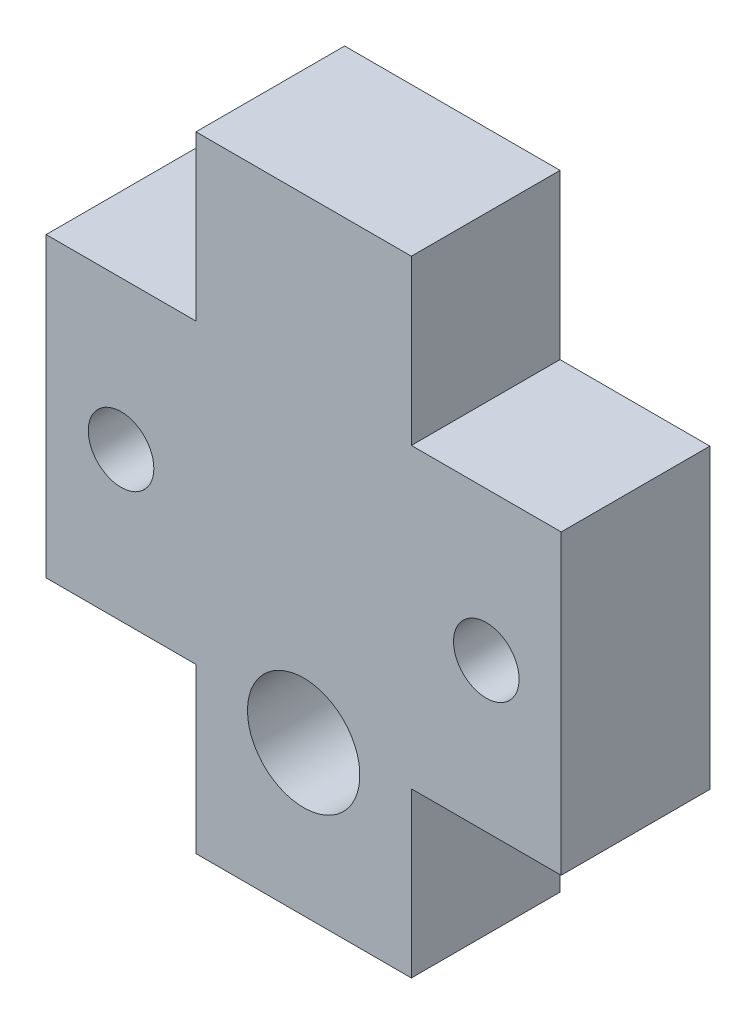
ISO-10303-21;
HEADER;
FILE_DESCRIPTION(('STEP AP214'),'2;1');
FILE_NAME('part.step','',(''),(''),'','','');
FILE_SCHEMA(('AUTOMOTIVE_DESIGN { 1 0 10303 214 1 1 1 1 }'));
ENDSEC;
DATA;
#1=APPLICATION_CONTEXT('core data for automotive mechanical design processes');
#2=APPLICATION_PROTOCOL_DEFINITION('international standard','automotive_design',2000,#1);
#3=PRODUCT_CONTEXT('',#1,'mechanical');
#4=PRODUCT('Part','Part','',(#3));
#5=PRODUCT_RELATED_PRODUCT_CATEGORY('part','',(#4));
#6=PRODUCT_DEFINITION_FORMATION('','',#4);
#7=PRODUCT_DEFINITION_CONTEXT('part definition',#1,'design');
#8=PRODUCT_DEFINITION('design','',#6,#7);
#9=PRODUCT_DEFINITION_SHAPE('','',#8);
#10=(LENGTH_UNIT() NAMED_UNIT(*) SI_UNIT(.MILLI.,.METRE.));
#11=(NAMED_UNIT(*) PLANE_ANGLE_UNIT() SI_UNIT($,.RADIAN.));
#12=(NAMED_UNIT(*) SI_UNIT($,.STERADIAN.) SOLID_ANGLE_UNIT());
#13=UNCERTAINTY_MEASURE_WITH_UNIT(LENGTH_MEASURE(1.E-05),#10,'distance_accuracy_value','');
#14=(GEOMETRIC_REPRESENTATION_CONTEXT(3) GLOBAL_UNCERTAINTY_ASSIGNED_CONTEXT((#13)) GLOBAL_UNIT_ASSIGNED_CONTEXT((#10,
#11,#12)) REPRESENTATION_CONTEXT('',''));
#15=CARTESIAN_POINT('',(0.,0.,0.));
#16=DIRECTION('',(0.,0.,1.));
#17=DIRECTION('',(1.,0.,0.));
#18=AXIS2_PLACEMENT_3D('',#15,#16,#17);
#19=CARTESIAN_POINT('',(11.,0.,6.35));
#20=DIRECTION('',(1.,0.,0.));
#21=DIRECTION('',(0.,0.,-1.));
#22=AXIS2_PLACEMENT_3D('',#19,#20,#21);
#23=PLANE('',#22);
#24=DIRECTION('',(0.,-1.,0.));
#25=VECTOR('',#24,1.);
#26=CARTESIAN_POINT('',(11.,0.,0.));
#27=LINE('',#26,#25);
#28=CARTESIAN_POINT('',(11.,6.35,0.));
#29=VERTEX_POINT('',#28);
#30=CARTESIAN_POINT('',(11.,-6.35,0.));
#31=VERTEX_POINT('',#30);
#32=EDGE_CURVE('E168',#29,#31,#27,.T.);
#33=ORIENTED_EDGE('',*,*,#32,.F.);
#34=DIRECTION('',(0.,0.,-1.));
#35=VECTOR('',#34,1.);
#36=CARTESIAN_POINT('',(11.,6.35,6.35));
#37=LINE('',#36,#35);
#38=CARTESIAN_POINT('',(11.,6.35,6.35));
#39=VERTEX_POINT('',#38);
#40=EDGE_CURVE('E11',#39,#29,#37,.T.);
#41=ORIENTED_EDGE('',*,*,#40,.F.);
#42=DIRECTION('',(0.,-1.,0.));
#43=VECTOR('',#42,1.);
#44=CARTESIAN_POINT('',(11.,0.,6.35));
#45=LINE('',#44,#43);
#46=CARTESIAN_POINT('',(11.,-6.35,6.35));
#47=VERTEX_POINT('',#46);
#48=EDGE_CURVE('E291',#39,#47,#45,.T.);
#49=ORIENTED_EDGE('',*,*,#48,.T.);
#50=DIRECTION('',(0.,0.,-1.));
#51=VECTOR('',#50,1.);
#52=CARTESIAN_POINT('',(11.,-6.35,6.35));
#53=LINE('',#52,#51);
#54=EDGE_CURVE('E100',#47,#31,#53,.T.);
#55=ORIENTED_EDGE('',*,*,#54,.T.);
#56=EDGE_LOOP('',(#33,#41,#49,#55));
#57=FACE_BOUND('',#56,.T.);
#58=ADVANCED_FACE('F36',(#57),#23,.T.);
#59=CARTESIAN_POINT('',(0.,6.35,6.35));
#60=DIRECTION('',(0.,1.,0.));
#61=DIRECTION('',(0.,0.,1.));
#62=AXIS2_PLACEMENT_3D('',#59,#60,#61);
#63=PLANE('',#62);
#64=DIRECTION('',(1.,0.,0.));
#65=VECTOR('',#64,1.);
#66=CARTESIAN_POINT('',(0.,6.35,0.));
#67=LINE('',#66,#65);
#68=CARTESIAN_POINT('',(4.6,6.35,0.));
#69=VERTEX_POINT('',#68);
#70=EDGE_CURVE('E171',#69,#29,#67,.T.);
#71=ORIENTED_EDGE('',*,*,#70,.F.);
#72=DIRECTION('',(0.,0.,-1.));
#73=VECTOR('',#72,1.);
#74=CARTESIAN_POINT('',(4.6,6.35,6.35));
#75=LINE('',#74,#73);
#76=CARTESIAN_POINT('',(4.6,6.35,6.35));
#77=VERTEX_POINT('',#76);
#78=EDGE_CURVE('E45',#77,#69,#75,.T.);
#79=ORIENTED_EDGE('',*,*,#78,.F.);
#80=DIRECTION('',(1.,0.,0.));
#81=VECTOR('',#80,1.);
#82=CARTESIAN_POINT('',(0.,6.35,6.35));
#83=LINE('',#82,#81);
#84=EDGE_CURVE('E228',#77,#39,#83,.T.);
#85=ORIENTED_EDGE('',*,*,#84,.T.);
#86=ORIENTED_EDGE('',*,*,#40,.T.);
#87=EDGE_LOOP('',(#71,#79,#85,#86));
#88=FACE_BOUND('',#87,.T.);
#89=ADVANCED_FACE('F227',(#88),#63,.T.);
#90=CARTESIAN_POINT('',(4.6,0.,6.35));
#91=DIRECTION('',(-1.,0.,0.));
#92=DIRECTION('',(0.,0.,1.));
#93=AXIS2_PLACEMENT_3D('',#90,#91,#92);
#94=PLANE('',#93);
#95=DIRECTION('',(0.,1.,0.));
#96=VECTOR('',#95,1.);
#97=CARTESIAN_POINT('',(4.6,0.,0.));
#98=LINE('',#97,#96);
#99=CARTESIAN_POINT('',(4.6,13.35,0.));
#100=VERTEX_POINT('',#99);
#101=EDGE_CURVE('E174',#69,#100,#98,.T.);
#102=ORIENTED_EDGE('',*,*,#101,.T.);
#103=DIRECTION('',(0.,0.,-1.));
#104=VECTOR('',#103,1.);
#105=CARTESIAN_POINT('',(4.6,13.35,6.35));
#106=LINE('',#105,#104);
#107=CARTESIAN_POINT('',(4.6,13.35,6.35));
#108=VERTEX_POINT('',#107);
#109=EDGE_CURVE('E213',#108,#100,#106,.T.);
#110=ORIENTED_EDGE('',*,*,#109,.F.);
#111=DIRECTION('',(0.,1.,0.));
#112=VECTOR('',#111,1.);
#113=CARTESIAN_POINT('',(4.6,0.,6.35));
#114=LINE('',#113,#112);
#115=EDGE_CURVE('E147',#77,#108,#114,.T.);
#116=ORIENTED_EDGE('',*,*,#115,.F.);
#117=ORIENTED_EDGE('',*,*,#78,.T.);
#118=EDGE_LOOP('',(#102,#110,#116,#117));
#119=FACE_BOUND('',#118,.T.);
#120=ADVANCED_FACE('F218',(#119),#94,.F.);
#121=CARTESIAN_POINT('',(0.,13.35,6.35));
#122=DIRECTION('',(0.,-1.,0.));
#123=DIRECTION('',(0.,0.,-1.));
#124=AXIS2_PLACEMENT_3D('',#121,#122,#123);
#125=PLANE('',#124);
#126=DIRECTION('',(-1.,0.,0.));
#127=VECTOR('',#126,1.);
#128=CARTESIAN_POINT('',(0.,13.35,0.));
#129=LINE('',#128,#127);
#130=CARTESIAN_POINT('',(-4.6,13.35,0.));
#131=VERTEX_POINT('',#130);
#132=EDGE_CURVE('E177',#100,#131,#129,.T.);
#133=ORIENTED_EDGE('',*,*,#132,.T.);
#134=DIRECTION('',(0.,0.,-1.));
#135=VECTOR('',#134,1.);
#136=CARTESIAN_POINT('',(-4.6,13.35,6.35));
#137=LINE('',#136,#135);
#138=CARTESIAN_POINT('',(-4.6,13.35,6.35));
#139=VERTEX_POINT('',#138);
#140=EDGE_CURVE('E211',#139,#131,#137,.T.);
#141=ORIENTED_EDGE('',*,*,#140,.F.);
#142=DIRECTION('',(-1.,0.,0.));
#143=VECTOR('',#142,1.);
#144=CARTESIAN_POINT('',(0.,13.35,6.35));
#145=LINE('',#144,#143);
#146=EDGE_CURVE('E294',#108,#139,#145,.T.);
#147=ORIENTED_EDGE('',*,*,#146,.F.);
#148=ORIENTED_EDGE('',*,*,#109,.T.);
#149=EDGE_LOOP('',(#133,#141,#147,#148));
#150=FACE_BOUND('',#149,.T.);
#151=ADVANCED_FACE('F235',(#150),#125,.F.);
#152=CARTESIAN_POINT('',(-4.6,0.,6.35));
#153=DIRECTION('',(-1.,0.,0.));
#154=DIRECTION('',(0.,0.,1.));
#155=AXIS2_PLACEMENT_3D('',#152,#153,#154);
#156=PLANE('',#155);
#157=DIRECTION('',(0.,1.,0.));
#158=VECTOR('',#157,1.);
#159=CARTESIAN_POINT('',(-4.6,0.,0.));
#160=LINE('',#159,#158);
#161=CARTESIAN_POINT('',(-4.6,6.35,0.));
#162=VERTEX_POINT('',#161);
#163=EDGE_CURVE('E181',#162,#131,#160,.T.);
#164=ORIENTED_EDGE('',*,*,#163,.F.);
#165=DIRECTION('',(0.,0.,-1.));
#166=VECTOR('',#165,1.);
#167=CARTESIAN_POINT('',(-4.6,6.35,6.35));
#168=LINE('',#167,#166);
#169=CARTESIAN_POINT('',(-4.6,6.35,6.35));
#170=VERTEX_POINT('',#169);
#171=EDGE_CURVE('E209',#170,#162,#168,.T.);
#172=ORIENTED_EDGE('',*,*,#171,.F.);
#173=DIRECTION('',(0.,1.,0.));
#174=VECTOR('',#173,1.);
#175=CARTESIAN_POINT('',(-4.6,0.,6.35));
#176=LINE('',#175,#174);
#177=EDGE_CURVE('E157',#170,#139,#176,.T.);
#178=ORIENTED_EDGE('',*,*,#177,.T.);
#179=ORIENTED_EDGE('',*,*,#140,.T.);
#180=EDGE_LOOP('',(#164,#172,#178,#179));
#181=FACE_BOUND('',#180,.T.);
#182=ADVANCED_FACE('F238',(#181),#156,.T.);
#183=CARTESIAN_POINT('',(0.,6.35,6.35));
#184=DIRECTION('',(0.,1.,0.));
#185=DIRECTION('',(0.,0.,1.));
#186=AXIS2_PLACEMENT_3D('',#183,#184,#185);
#187=PLANE('',#186);
#188=DIRECTION('',(1.,0.,0.));
#189=VECTOR('',#188,1.);
#190=CARTESIAN_POINT('',(0.,6.35,0.));
#191=LINE('',#190,#189);
#192=CARTESIAN_POINT('',(-11.,6.35,0.));
#193=VERTEX_POINT('',#192);
#194=EDGE_CURVE('E184',#193,#162,#191,.T.);
#195=ORIENTED_EDGE('',*,*,#194,.F.);
#196=DIRECTION('',(0.,0.,-1.));
#197=VECTOR('',#196,1.);
#198=CARTESIAN_POINT('',(-11.,6.35,6.35));
#199=LINE('',#198,#197);
#200=CARTESIAN_POINT('',(-11.,6.35,6.35));
#201=VERTEX_POINT('',#200);
#202=EDGE_CURVE('E207',#201,#193,#199,.T.);
#203=ORIENTED_EDGE('',*,*,#202,.F.);
#204=DIRECTION('',(1.,0.,0.));
#205=VECTOR('',#204,1.);
#206=CARTESIAN_POINT('',(0.,6.35,6.35));
#207=LINE('',#206,#205);
#208=EDGE_CURVE('E297',#201,#170,#207,.T.);
#209=ORIENTED_EDGE('',*,*,#208,.T.);
#210=ORIENTED_EDGE('',*,*,#171,.T.);
#211=EDGE_LOOP('',(#195,#203,#209,#210));
#212=FACE_BOUND('',#211,.T.);
#213=ADVANCED_FACE('F240',(#212),#187,.T.);
#214=CARTESIAN_POINT('',(-11.,0.,6.35));
#215=DIRECTION('',(1.,0.,0.));
#216=DIRECTION('',(0.,0.,-1.));
#217=AXIS2_PLACEMENT_3D('',#214,#215,#216);
#218=PLANE('',#217);
#219=DIRECTION('',(0.,-1.,0.));
#220=VECTOR('',#219,1.);
#221=CARTESIAN_POINT('',(-11.,0.,0.));
#222=LINE('',#221,#220);
#223=CARTESIAN_POINT('',(-11.,-6.35,0.));
#224=VERTEX_POINT('',#223);
#225=EDGE_CURVE('E188',#193,#224,#222,.T.);
#226=ORIENTED_EDGE('',*,*,#225,.T.);
#227=DIRECTION('',(0.,0.,-1.));
#228=VECTOR('',#227,1.);
#229=CARTESIAN_POINT('',(-11.,-6.35,6.35));
#230=LINE('',#229,#228);
#231=CARTESIAN_POINT('',(-11.,-6.35,6.35));
#232=VERTEX_POINT('',#231);
#233=EDGE_CURVE('E205',#232,#224,#230,.T.);
#234=ORIENTED_EDGE('',*,*,#233,.F.);
#235=DIRECTION('',(0.,-1.,0.));
#236=VECTOR('',#235,1.);
#237=CARTESIAN_POINT('',(-11.,0.,6.35));
#238=LINE('',#237,#236);
#239=EDGE_CURVE('E299',#201,#232,#238,.T.);
#240=ORIENTED_EDGE('',*,*,#239,.F.);
#241=ORIENTED_EDGE('',*,*,#202,.T.);
#242=EDGE_LOOP('',(#226,#234,#240,#241));
#243=FACE_BOUND('',#242,.T.);
#244=ADVANCED_FACE('F243',(#243),#218,.F.);
#245=CARTESIAN_POINT('',(0.,-6.35,6.35));
#246=DIRECTION('',(0.,-1.,0.));
#247=DIRECTION('',(0.,0.,-1.));
#248=AXIS2_PLACEMENT_3D('',#245,#246,#247);
#249=PLANE('',#248);
#250=DIRECTION('',(-1.,0.,0.));
#251=VECTOR('',#250,1.);
#252=CARTESIAN_POINT('',(0.,-6.35,0.));
#253=LINE('',#252,#251);
#254=CARTESIAN_POINT('',(-4.6,-6.35,0.));
#255=VERTEX_POINT('',#254);
#256=EDGE_CURVE('E191',#255,#224,#253,.T.);
#257=ORIENTED_EDGE('',*,*,#256,.F.);
#258=DIRECTION('',(0.,0.,-1.));
#259=VECTOR('',#258,1.);
#260=CARTESIAN_POINT('',(-4.6,-6.35,6.35));
#261=LINE('',#260,#259);
#262=CARTESIAN_POINT('',(-4.6,-6.35,6.35));
#263=VERTEX_POINT('',#262);
#264=EDGE_CURVE('E203',#263,#255,#261,.T.);
#265=ORIENTED_EDGE('',*,*,#264,.F.);
#266=DIRECTION('',(-1.,0.,0.));
#267=VECTOR('',#266,1.);
#268=CARTESIAN_POINT('',(0.,-6.35,6.35));
#269=LINE('',#268,#267);
#270=EDGE_CURVE('E155',#263,#232,#269,.T.);
#271=ORIENTED_EDGE('',*,*,#270,.T.);
#272=ORIENTED_EDGE('',*,*,#233,.T.);
#273=EDGE_LOOP('',(#257,#265,#271,#272));
#274=FACE_BOUND('',#273,.T.);
#275=ADVANCED_FACE('F247',(#274),#249,.T.);
#276=CARTESIAN_POINT('',(-4.6,-13.35,0.));
#277=VERTEX_POINT('',#276);
#278=EDGE_CURVE('E185',#277,#255,#160,.T.);
#279=ORIENTED_EDGE('',*,*,#278,.F.);
#280=DIRECTION('',(0.,0.,-1.));
#281=VECTOR('',#280,1.);
#282=CARTESIAN_POINT('',(-4.6,-13.35,6.35));
#283=LINE('',#282,#281);
#284=CARTESIAN_POINT('',(-4.6,-13.35,6.35));
#285=VERTEX_POINT('',#284);
#286=EDGE_CURVE('E140',#285,#277,#283,.T.);
#287=ORIENTED_EDGE('',*,*,#286,.F.);
#288=EDGE_CURVE('E153',#285,#263,#176,.T.);
#289=ORIENTED_EDGE('',*,*,#288,.T.);
#290=ORIENTED_EDGE('',*,*,#264,.T.);
#291=EDGE_LOOP('',(#279,#287,#289,#290));
#292=FACE_BOUND('',#291,.T.);
#293=ADVANCED_FACE('F251',(#292),#156,.T.);
#294=CARTESIAN_POINT('',(0.,-13.35,6.35));
#295=DIRECTION('',(0.,-1.,0.));
#296=DIRECTION('',(0.,0.,-1.));
#297=AXIS2_PLACEMENT_3D('',#294,#295,#296);
#298=PLANE('',#297);
#299=DIRECTION('',(-1.,0.,0.));
#300=VECTOR('',#299,1.);
#301=CARTESIAN_POINT('',(0.,-13.35,0.));
#302=LINE('',#301,#300);
#303=CARTESIAN_POINT('',(4.6,-13.35,0.));
#304=VERTEX_POINT('',#303);
#305=EDGE_CURVE('E137',#304,#277,#302,.T.);
#306=ORIENTED_EDGE('',*,*,#305,.F.);
#307=DIRECTION('',(0.,0.,-1.));
#308=VECTOR('',#307,1.);
#309=CARTESIAN_POINT('',(4.6,-13.35,6.35));
#310=LINE('',#309,#308);
#311=CARTESIAN_POINT('',(4.6,-13.35,6.35));
#312=VERTEX_POINT('',#311);
#313=EDGE_CURVE('E131',#312,#304,#310,.T.);
#314=ORIENTED_EDGE('',*,*,#313,.F.);
#315=DIRECTION('',(-1.,0.,0.));
#316=VECTOR('',#315,1.);
#317=CARTESIAN_POINT('',(0.,-13.35,6.35));
#318=LINE('',#317,#316);
#319=EDGE_CURVE('E135',#312,#285,#318,.T.);
#320=ORIENTED_EDGE('',*,*,#319,.T.);
#321=ORIENTED_EDGE('',*,*,#286,.T.);
#322=EDGE_LOOP('',(#306,#314,#320,#321));
#323=FACE_BOUND('',#322,.T.);
#324=ADVANCED_FACE('F133',(#323),#298,.T.);
#325=CARTESIAN_POINT('',(4.6,-6.35,0.));
#326=VERTEX_POINT('',#325);
#327=EDGE_CURVE('E178',#304,#326,#98,.T.);
#328=ORIENTED_EDGE('',*,*,#327,.T.);
#329=DIRECTION('',(0.,0.,-1.));
#330=VECTOR('',#329,1.);
#331=CARTESIAN_POINT('',(4.6,-6.35,6.35));
#332=LINE('',#331,#330);
#333=CARTESIAN_POINT('',(4.6,-6.35,6.35));
#334=VERTEX_POINT('',#333);
#335=EDGE_CURVE('E141',#334,#326,#332,.T.);
#336=ORIENTED_EDGE('',*,*,#335,.F.);
#337=EDGE_CURVE('E144',#312,#334,#114,.T.);
#338=ORIENTED_EDGE('',*,*,#337,.F.);
#339=ORIENTED_EDGE('',*,*,#313,.T.);
#340=EDGE_LOOP('',(#328,#336,#338,#339));
#341=FACE_BOUND('',#340,.T.);
#342=ADVANCED_FACE('F145',(#341),#94,.F.);
#343=CARTESIAN_POINT('',(0.,-6.35,6.35));
#344=DIRECTION('',(0.,1.,0.));
#345=DIRECTION('',(0.,0.,1.));
#346=AXIS2_PLACEMENT_3D('',#343,#344,#345);
#347=PLANE('',#346);
#348=DIRECTION('',(1.,0.,0.));
#349=VECTOR('',#348,1.);
#350=CARTESIAN_POINT('',(0.,-6.35,0.));
#351=LINE('',#350,#349);
#352=EDGE_CURVE('E93',#326,#31,#351,.T.);
#353=ORIENTED_EDGE('',*,*,#352,.T.);
#354=ORIENTED_EDGE('',*,*,#54,.F.);
#355=DIRECTION('',(1.,0.,0.));
#356=VECTOR('',#355,1.);
#357=CARTESIAN_POINT('',(0.,-6.35,6.35));
#358=LINE('',#357,#356);
#359=EDGE_CURVE('E53',#334,#47,#358,.T.);
#360=ORIENTED_EDGE('',*,*,#359,.F.);
#361=ORIENTED_EDGE('',*,*,#335,.T.);
#362=EDGE_LOOP('',(#353,#354,#360,#361));
#363=FACE_BOUND('',#362,.T.);
#364=ADVANCED_FACE('F260',(#363),#347,.F.);
#365=CARTESIAN_POINT('',(7.8,0.,6.35));
#366=DIRECTION('',(0.,0.,-1.));
#367=DIRECTION('',(-1.,0.,0.));
#368=AXIS2_PLACEMENT_3D('',#365,#366,#367);
#369=CYLINDRICAL_SURFACE('',#368,1.4);
#370=CARTESIAN_POINT('',(7.8,0.,6.35));
#371=DIRECTION('',(0.,0.,1.));
#372=DIRECTION('',(1.,0.,0.));
#373=AXIS2_PLACEMENT_3D('',#370,#371,#372);
#374=CIRCLE('',#373,1.4);
#375=CARTESIAN_POINT('',(9.2,0.,6.35));
#376=VERTEX_POINT('',#375);
#377=EDGE_CURVE('E199',#376,#376,#374,.T.);
#378=ORIENTED_EDGE('',*,*,#377,.T.);
#379=EDGE_LOOP('',(#378));
#380=FACE_BOUND('',#379,.T.);
#381=CARTESIAN_POINT('',(7.8,0.,0.));
#382=DIRECTION('',(0.,0.,1.));
#383=DIRECTION('',(1.,0.,0.));
#384=AXIS2_PLACEMENT_3D('',#381,#382,#383);
#385=CIRCLE('',#384,1.4);
#386=CARTESIAN_POINT('',(9.2,0.,0.));
#387=VERTEX_POINT('',#386);
#388=EDGE_CURVE('E165',#387,#387,#385,.T.);
#389=ORIENTED_EDGE('',*,*,#388,.F.);
#390=EDGE_LOOP('',(#389));
#391=FACE_BOUND('',#390,.T.);
#392=ADVANCED_FACE('F38',(#380,#391),#369,.F.);
#393=CARTESIAN_POINT('',(-7.8,0.,6.35));
#394=DIRECTION('',(0.,0.,-1.));
#395=DIRECTION('',(-1.,0.,0.));
#396=AXIS2_PLACEMENT_3D('',#393,#394,#395);
#397=CYLINDRICAL_SURFACE('',#396,1.4);
#398=CARTESIAN_POINT('',(-7.8,0.,6.35));
#399=DIRECTION('',(0.,0.,1.));
#400=DIRECTION('',(1.,0.,0.));
#401=AXIS2_PLACEMENT_3D('',#398,#399,#400);
#402=CIRCLE('',#401,1.4);
#403=CARTESIAN_POINT('',(-6.4,0.,6.35));
#404=VERTEX_POINT('',#403);
#405=EDGE_CURVE('E162',#404,#404,#402,.T.);
#406=ORIENTED_EDGE('',*,*,#405,.T.);
#407=EDGE_LOOP('',(#406));
#408=FACE_BOUND('',#407,.T.);
#409=CARTESIAN_POINT('',(-7.8,0.,0.));
#410=DIRECTION('',(0.,0.,1.));
#411=DIRECTION('',(1.,0.,0.));
#412=AXIS2_PLACEMENT_3D('',#409,#410,#411);
#413=CIRCLE('',#412,1.4);
#414=CARTESIAN_POINT('',(-6.4,0.,0.));
#415=VERTEX_POINT('',#414);
#416=EDGE_CURVE('E196',#415,#415,#413,.T.);
#417=ORIENTED_EDGE('',*,*,#416,.F.);
#418=EDGE_LOOP('',(#417));
#419=FACE_BOUND('',#418,.T.);
#420=ADVANCED_FACE('F264',(#408,#419),#397,.F.);
#421=CARTESIAN_POINT('',(0.,0.,6.35));
#422=DIRECTION('',(0.,0.,1.));
#423=DIRECTION('',(1.,0.,0.));
#424=AXIS2_PLACEMENT_3D('',#421,#422,#423);
#425=PLANE('',#424);
#426=CARTESIAN_POINT('',(0.,-6.95,6.35));
#427=DIRECTION('',(0.,0.,-1.));
#428=DIRECTION('',(-1.,0.,0.));
#429=AXIS2_PLACEMENT_3D('',#426,#427,#428);
#430=CIRCLE('',#429,2.4);
#431=CARTESIAN_POINT('',(-2.4,-6.95,6.35));
#432=VERTEX_POINT('',#431);
#433=EDGE_CURVE('E169',#432,#432,#430,.T.);
#434=ORIENTED_EDGE('',*,*,#433,.T.);
#435=EDGE_LOOP('',(#434));
#436=FACE_BOUND('',#435,.T.);
#437=ORIENTED_EDGE('',*,*,#377,.F.);
#438=EDGE_LOOP('',(#437));
#439=FACE_BOUND('',#438,.T.);
#440=ORIENTED_EDGE('',*,*,#48,.F.);
#441=ORIENTED_EDGE('',*,*,#84,.F.);
#442=ORIENTED_EDGE('',*,*,#115,.T.);
#443=ORIENTED_EDGE('',*,*,#146,.T.);
#444=ORIENTED_EDGE('',*,*,#177,.F.);
#445=ORIENTED_EDGE('',*,*,#208,.F.);
#446=ORIENTED_EDGE('',*,*,#239,.T.);
#447=ORIENTED_EDGE('',*,*,#270,.F.);
#448=ORIENTED_EDGE('',*,*,#288,.F.);
#449=ORIENTED_EDGE('',*,*,#319,.F.);
#450=ORIENTED_EDGE('',*,*,#337,.T.);
#451=ORIENTED_EDGE('',*,*,#359,.T.);
#452=EDGE_LOOP('',(#440,#441,#442,#443,#444,#445,#446,#447,#448,#449,#450,#451));
#453=FACE_BOUND('',#452,.T.);
#454=ORIENTED_EDGE('',*,*,#405,.F.);
#455=EDGE_LOOP('',(#454));
#456=FACE_BOUND('',#455,.T.);
#457=ADVANCED_FACE('F149',(#436,#439,#453,#456),#425,.T.);
#458=CARTESIAN_POINT('',(0.,0.,0.));
#459=DIRECTION('',(0.,0.,1.));
#460=DIRECTION('',(1.,0.,0.));
#461=AXIS2_PLACEMENT_3D('',#458,#459,#460);
#462=PLANE('',#461);
#463=CARTESIAN_POINT('',(0.,-6.95,0.));
#464=DIRECTION('',(0.,0.,-1.));
#465=DIRECTION('',(-1.,0.,0.));
#466=AXIS2_PLACEMENT_3D('',#463,#464,#465);
#467=CIRCLE('',#466,2.4);
#468=CARTESIAN_POINT('',(-2.4,-6.95,0.));
#469=VERTEX_POINT('',#468);
#470=EDGE_CURVE('E285',#469,#469,#467,.T.);
#471=ORIENTED_EDGE('',*,*,#470,.F.);
#472=EDGE_LOOP('',(#471));
#473=FACE_BOUND('',#472,.T.);
#474=ORIENTED_EDGE('',*,*,#388,.T.);
#475=EDGE_LOOP('',(#474));
#476=FACE_BOUND('',#475,.T.);
#477=ORIENTED_EDGE('',*,*,#32,.T.);
#478=ORIENTED_EDGE('',*,*,#352,.F.);
#479=ORIENTED_EDGE('',*,*,#327,.F.);
#480=ORIENTED_EDGE('',*,*,#305,.T.);
#481=ORIENTED_EDGE('',*,*,#278,.T.);
#482=ORIENTED_EDGE('',*,*,#256,.T.);
#483=ORIENTED_EDGE('',*,*,#225,.F.);
#484=ORIENTED_EDGE('',*,*,#194,.T.);
#485=ORIENTED_EDGE('',*,*,#163,.T.);
#486=ORIENTED_EDGE('',*,*,#132,.F.);
#487=ORIENTED_EDGE('',*,*,#101,.F.);
#488=ORIENTED_EDGE('',*,*,#70,.T.);
#489=EDGE_LOOP('',(#477,#478,#479,#480,#481,#482,#483,#484,#485,#486,#487,#488));
#490=FACE_BOUND('',#489,.T.);
#491=ORIENTED_EDGE('',*,*,#416,.T.);
#492=EDGE_LOOP('',(#491));
#493=FACE_BOUND('',#492,.T.);
#494=ADVANCED_FACE('F225',(#473,#476,#490,#493),#462,.F.);
#495=CARTESIAN_POINT('',(0.,-6.95,6.35));
#496=DIRECTION('',(0.,0.,-1.));
#497=DIRECTION('',(-1.,0.,0.));
#498=AXIS2_PLACEMENT_3D('',#495,#496,#497);
#499=CYLINDRICAL_SURFACE('',#498,2.4);
#500=ORIENTED_EDGE('',*,*,#433,.F.);
#501=EDGE_LOOP('',(#500));
#502=FACE_BOUND('',#501,.T.);
#503=ORIENTED_EDGE('',*,*,#470,.T.);
#504=EDGE_LOOP('',(#503));
#505=FACE_BOUND('',#504,.T.);
#506=ADVANCED_FACE('F270',(#502,#505),#499,.F.);
#507=CLOSED_SHELL('',(#58,#89,#120,#151,#182,#213,#244,#275,#293,#324,#342,#364,#392,#420,#457,
#494,#506));
#508=MANIFOLD_SOLID_BREP('B2',#507);
#509=ADVANCED_BREP_SHAPE_REPRESENTATION('',(#18,#508),#14);
#510=SHAPE_DEFINITION_REPRESENTATION(#9,#509);
ENDSEC;
END-ISO-10303-21;
